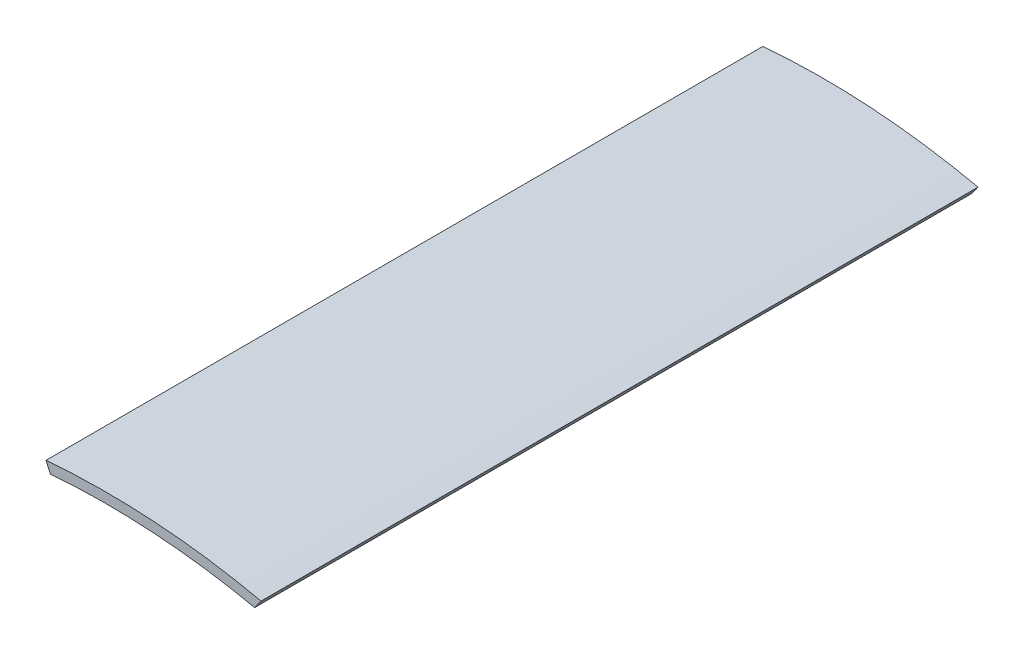
ISO-10303-21;
HEADER;
FILE_DESCRIPTION(('STEP AP214'),'2;1');
FILE_NAME('part.step','',(''),(''),'','','');
FILE_SCHEMA(('AUTOMOTIVE_DESIGN { 1 0 10303 214 1 1 1 1 }'));
ENDSEC;
DATA;
#1=APPLICATION_CONTEXT('core data for automotive mechanical design processes');
#2=APPLICATION_PROTOCOL_DEFINITION('international standard','automotive_design',2000,#1);
#3=PRODUCT_CONTEXT('',#1,'mechanical');
#4=PRODUCT('Part','Part','',(#3));
#5=PRODUCT_RELATED_PRODUCT_CATEGORY('part','',(#4));
#6=PRODUCT_DEFINITION_FORMATION('','',#4);
#7=PRODUCT_DEFINITION_CONTEXT('part definition',#1,'design');
#8=PRODUCT_DEFINITION('design','',#6,#7);
#9=PRODUCT_DEFINITION_SHAPE('','',#8);
#10=(LENGTH_UNIT() NAMED_UNIT(*) SI_UNIT(.MILLI.,.METRE.));
#11=(NAMED_UNIT(*) PLANE_ANGLE_UNIT() SI_UNIT($,.RADIAN.));
#12=(NAMED_UNIT(*) SI_UNIT($,.STERADIAN.) SOLID_ANGLE_UNIT());
#13=UNCERTAINTY_MEASURE_WITH_UNIT(LENGTH_MEASURE(1.E-05),#10,'distance_accuracy_value','');
#14=(GEOMETRIC_REPRESENTATION_CONTEXT(3) GLOBAL_UNCERTAINTY_ASSIGNED_CONTEXT((#13)) GLOBAL_UNIT_ASSIGNED_CONTEXT((#10,
#11,#12)) REPRESENTATION_CONTEXT('',''));
#15=CARTESIAN_POINT('',(0.,0.,0.));
#16=DIRECTION('',(0.,0.,1.));
#17=DIRECTION('',(1.,0.,0.));
#18=AXIS2_PLACEMENT_3D('',#15,#16,#17);
#19=CARTESIAN_POINT('',(-1.5788152505991,-2.98222875898649,0.));
#20=DIRECTION('',(0.,0.,1.));
#21=DIRECTION('',(1.,0.,0.));
#22=AXIS2_PLACEMENT_3D('',#19,#20,#21);
#23=CYLINDRICAL_SURFACE('',#22,4.93);
#24=DIRECTION('',(0.,0.,1.));
#25=VECTOR('',#24,1.);
#26=CARTESIAN_POINT('',(-1.96920760598267,1.9322899162103,0.));
#27=LINE('',#26,#25);
#28=CARTESIAN_POINT('',(-1.96920760598267,1.9322899162103,0.));
#29=VERTEX_POINT('',#28);
#30=CARTESIAN_POINT('',(-1.96920760598267,1.9322899162103,5.));
#31=VERTEX_POINT('',#30);
#32=EDGE_CURVE('E58',#29,#31,#27,.T.);
#33=ORIENTED_EDGE('',*,*,#32,.F.);
#34=CARTESIAN_POINT('',(-1.5788152505991,-2.98222875898649,0.));
#35=DIRECTION('',(0.,0.,1.));
#36=DIRECTION('',(1.,0.,0.));
#37=AXIS2_PLACEMENT_3D('',#34,#35,#36);
#38=CIRCLE('',#37,4.93);
#39=CARTESIAN_POINT('',(-0.544763141756115,1.83810693847249,0.));
#40=VERTEX_POINT('',#39);
#41=EDGE_CURVE('E80',#29,#40,#38,.F.);
#42=ORIENTED_EDGE('',*,*,#41,.T.);
#43=DIRECTION('',(0.,0.,1.));
#44=VECTOR('',#43,1.);
#45=CARTESIAN_POINT('',(-0.544763141756115,1.83810693847249,0.));
#46=LINE('',#45,#44);
#47=CARTESIAN_POINT('',(-0.544763141756115,1.83810693847249,5.));
#48=VERTEX_POINT('',#47);
#49=EDGE_CURVE('E60',#48,#40,#46,.F.);
#50=ORIENTED_EDGE('',*,*,#49,.F.);
#51=CARTESIAN_POINT('',(-1.5788152505991,-2.98222875898649,5.));
#52=DIRECTION('',(0.,0.,1.));
#53=DIRECTION('',(1.,0.,0.));
#54=AXIS2_PLACEMENT_3D('',#51,#52,#53);
#55=CIRCLE('',#54,4.93);
#56=EDGE_CURVE('E20',#31,#48,#55,.F.);
#57=ORIENTED_EDGE('',*,*,#56,.F.);
#58=EDGE_LOOP('',(#33,#42,#50,#57));
#59=FACE_BOUND('',#58,.T.);
#60=ADVANCED_FACE('F17',(#59),#23,.F.);
#61=CARTESIAN_POINT('',(-1.25087474142416,1.94936534805049,5.));
#62=DIRECTION('',(0.,0.,1.));
#63=DIRECTION('',(1.,0.,0.));
#64=AXIS2_PLACEMENT_3D('',#61,#62,#63);
#65=PLANE('',#64);
#66=DIRECTION('',(0.413970992688452,-0.910290073115454,0.));
#67=VECTOR('',#66,1.);
#68=CARTESIAN_POINT('',(-1.96920760598267,1.9322899162103,5.));
#69=LINE('',#68,#67);
#70=CARTESIAN_POINT('',(-2.,2.,5.));
#71=VERTEX_POINT('',#70);
#72=EDGE_CURVE('E65',#31,#71,#69,.F.);
#73=ORIENTED_EDGE('',*,*,#72,.F.);
#74=ORIENTED_EDGE('',*,*,#56,.T.);
#75=DIRECTION('',(0.586029007311549,0.81029007311545,0.));
#76=VECTOR('',#75,1.);
#77=CARTESIAN_POINT('',(-0.5,1.9,5.));
#78=LINE('',#77,#76);
#79=CARTESIAN_POINT('',(-0.499999999999999,1.9,5.));
#80=VERTEX_POINT('',#79);
#81=EDGE_CURVE('E63',#80,#48,#78,.F.);
#82=ORIENTED_EDGE('',*,*,#81,.F.);
#83=CARTESIAN_POINT('',(-1.5788152505991,-2.98222875898649,5.));
#84=DIRECTION('',(0.,0.,1.));
#85=DIRECTION('',(1.,0.,0.));
#86=AXIS2_PLACEMENT_3D('',#83,#84,#85);
#87=CIRCLE('',#86,5.);
#88=EDGE_CURVE('E68',#71,#80,#87,.F.);
#89=ORIENTED_EDGE('',*,*,#88,.F.);
#90=EDGE_LOOP('',(#73,#74,#82,#89));
#91=FACE_BOUND('',#90,.T.);
#92=ADVANCED_FACE('F66',(#91),#65,.T.);
#93=CARTESIAN_POINT('',(-0.5,1.9,0.));
#94=DIRECTION('',(0.81029007311545,-0.586029007311549,0.));
#95=DIRECTION('',(0.586029007311549,0.81029007311545,0.));
#96=AXIS2_PLACEMENT_3D('',#93,#94,#95);
#97=PLANE('',#96);
#98=DIRECTION('',(0.586029007311547,0.810290073115451,0.));
#99=VECTOR('',#98,1.);
#100=CARTESIAN_POINT('',(-0.544763141756115,1.83810693847249,0.));
#101=LINE('',#100,#99);
#102=CARTESIAN_POINT('',(-0.499999999999999,1.9,0.));
#103=VERTEX_POINT('',#102);
#104=EDGE_CURVE('E70',#40,#103,#101,.T.);
#105=ORIENTED_EDGE('',*,*,#104,.T.);
#106=DIRECTION('',(0.,0.,1.));
#107=VECTOR('',#106,1.);
#108=CARTESIAN_POINT('',(-0.499999999999999,1.9,0.));
#109=LINE('',#108,#107);
#110=EDGE_CURVE('E74',#80,#103,#109,.F.);
#111=ORIENTED_EDGE('',*,*,#110,.F.);
#112=ORIENTED_EDGE('',*,*,#81,.T.);
#113=ORIENTED_EDGE('',*,*,#49,.T.);
#114=EDGE_LOOP('',(#105,#111,#112,#113));
#115=FACE_BOUND('',#114,.T.);
#116=ADVANCED_FACE('F88',(#115),#97,.T.);
#117=CARTESIAN_POINT('',(-1.25087474142416,1.94936534805049,0.));
#118=DIRECTION('',(0.,0.,1.));
#119=DIRECTION('',(1.,0.,0.));
#120=AXIS2_PLACEMENT_3D('',#117,#118,#119);
#121=PLANE('',#120);
#122=ORIENTED_EDGE('',*,*,#104,.F.);
#123=ORIENTED_EDGE('',*,*,#41,.F.);
#124=DIRECTION('',(0.413970992688452,-0.910290073115454,0.));
#125=VECTOR('',#124,1.);
#126=CARTESIAN_POINT('',(-1.96920760598267,1.9322899162103,0.));
#127=LINE('',#126,#125);
#128=CARTESIAN_POINT('',(-2.,2.,0.));
#129=VERTEX_POINT('',#128);
#130=EDGE_CURVE('E35',#129,#29,#127,.T.);
#131=ORIENTED_EDGE('',*,*,#130,.F.);
#132=CARTESIAN_POINT('',(-1.5788152505991,-2.98222875898649,0.));
#133=DIRECTION('',(0.,0.,1.));
#134=DIRECTION('',(1.,0.,0.));
#135=AXIS2_PLACEMENT_3D('',#132,#133,#134);
#136=CIRCLE('',#135,5.);
#137=EDGE_CURVE('E26',#103,#129,#136,.T.);
#138=ORIENTED_EDGE('',*,*,#137,.F.);
#139=EDGE_LOOP('',(#122,#123,#131,#138));
#140=FACE_BOUND('',#139,.T.);
#141=ADVANCED_FACE('F91',(#140),#121,.F.);
#142=CARTESIAN_POINT('',(-1.96920760598267,1.9322899162103,0.));
#143=DIRECTION('',(-0.910290073115454,-0.413970992688452,0.));
#144=DIRECTION('',(0.413970992688452,-0.910290073115454,0.));
#145=AXIS2_PLACEMENT_3D('',#142,#143,#144);
#146=PLANE('',#145);
#147=ORIENTED_EDGE('',*,*,#130,.T.);
#148=ORIENTED_EDGE('',*,*,#32,.T.);
#149=ORIENTED_EDGE('',*,*,#72,.T.);
#150=DIRECTION('',(0.,0.,1.));
#151=VECTOR('',#150,1.);
#152=CARTESIAN_POINT('',(-2.,2.,0.));
#153=LINE('',#152,#151);
#154=EDGE_CURVE('E11',#129,#71,#153,.T.);
#155=ORIENTED_EDGE('',*,*,#154,.F.);
#156=EDGE_LOOP('',(#147,#148,#149,#155));
#157=FACE_BOUND('',#156,.T.);
#158=ADVANCED_FACE('F72',(#157),#146,.T.);
#159=CARTESIAN_POINT('',(-1.5788152505991,-2.98222875898649,0.));
#160=DIRECTION('',(0.,0.,1.));
#161=DIRECTION('',(1.,0.,0.));
#162=AXIS2_PLACEMENT_3D('',#159,#160,#161);
#163=CYLINDRICAL_SURFACE('',#162,5.);
#164=ORIENTED_EDGE('',*,*,#137,.T.);
#165=ORIENTED_EDGE('',*,*,#154,.T.);
#166=ORIENTED_EDGE('',*,*,#88,.T.);
#167=ORIENTED_EDGE('',*,*,#110,.T.);
#168=EDGE_LOOP('',(#164,#165,#166,#167));
#169=FACE_BOUND('',#168,.T.);
#170=ADVANCED_FACE('F90',(#169),#163,.T.);
#171=CLOSED_SHELL('',(#60,#92,#116,#141,#158,#170));
#172=MANIFOLD_SOLID_BREP('B1',#171);
#173=ADVANCED_BREP_SHAPE_REPRESENTATION('',(#18,#172),#14);
#174=SHAPE_DEFINITION_REPRESENTATION(#9,#173);
ENDSEC;
END-ISO-10303-21;
